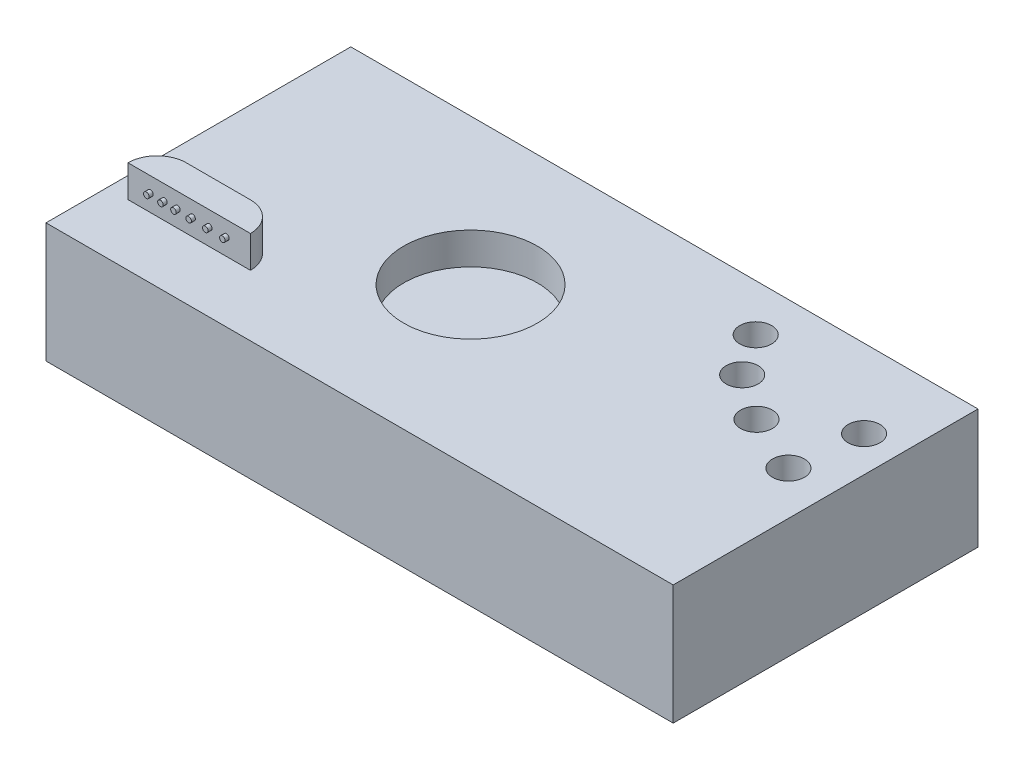
ISO-10303-21;
HEADER;
FILE_DESCRIPTION(('STEP AP214'),'2;1');
FILE_NAME('part.step','',(''),(''),'','','');
FILE_SCHEMA(('AUTOMOTIVE_DESIGN { 1 0 10303 214 1 1 1 1 }'));
ENDSEC;
DATA;
#1=APPLICATION_CONTEXT('core data for automotive mechanical design processes');
#2=APPLICATION_PROTOCOL_DEFINITION('international standard','automotive_design',2000,#1);
#3=PRODUCT_CONTEXT('',#1,'mechanical');
#4=PRODUCT('Part','Part','',(#3));
#5=PRODUCT_RELATED_PRODUCT_CATEGORY('part','',(#4));
#6=PRODUCT_DEFINITION_FORMATION('','',#4);
#7=PRODUCT_DEFINITION_CONTEXT('part definition',#1,'design');
#8=PRODUCT_DEFINITION('design','',#6,#7);
#9=PRODUCT_DEFINITION_SHAPE('','',#8);
#10=(LENGTH_UNIT() NAMED_UNIT(*) SI_UNIT(.MILLI.,.METRE.));
#11=(NAMED_UNIT(*) PLANE_ANGLE_UNIT() SI_UNIT($,.RADIAN.));
#12=(NAMED_UNIT(*) SI_UNIT($,.STERADIAN.) SOLID_ANGLE_UNIT());
#13=UNCERTAINTY_MEASURE_WITH_UNIT(LENGTH_MEASURE(1.E-05),#10,'distance_accuracy_value','');
#14=(GEOMETRIC_REPRESENTATION_CONTEXT(3) GLOBAL_UNCERTAINTY_ASSIGNED_CONTEXT((#13)) GLOBAL_UNIT_ASSIGNED_CONTEXT((#10,
#11,#12)) REPRESENTATION_CONTEXT('',''));
#15=CARTESIAN_POINT('',(0.,0.,0.));
#16=DIRECTION('',(0.,0.,1.));
#17=DIRECTION('',(1.,0.,0.));
#18=AXIS2_PLACEMENT_3D('',#15,#16,#17);
#19=CARTESIAN_POINT('',(0.,38.,0.));
#20=DIRECTION('',(0.,0.,-1.));
#21=DIRECTION('',(-1.,0.,0.));
#22=AXIS2_PLACEMENT_3D('',#19,#20,#21);
#23=PLANE('',#22);
#24=CARTESIAN_POINT('',(-118.643776601544,34.2556021608402,0.));
#25=DIRECTION('',(0.,0.,-1.));
#26=DIRECTION('',(-1.,0.,0.));
#27=AXIS2_PLACEMENT_3D('',#24,#25,#26);
#28=CIRCLE('',#27,0.700000000000014);
#29=CARTESIAN_POINT('',(-119.343776601544,34.2556021608402,0.));
#30=VERTEX_POINT('',#29);
#31=EDGE_CURVE('E41',#30,#30,#28,.F.);
#32=ORIENTED_EDGE('',*,*,#31,.F.);
#33=EDGE_LOOP('',(#32));
#34=FACE_BOUND('',#33,.T.);
#35=CARTESIAN_POINT('',(-126.62164694386,34.2556021608402,0.));
#36=DIRECTION('',(0.,0.,-1.));
#37=DIRECTION('',(-1.,0.,0.));
#38=AXIS2_PLACEMENT_3D('',#35,#36,#37);
#39=CIRCLE('',#38,0.700000000000014);
#40=CARTESIAN_POINT('',(-127.32164694386,34.2556021608402,0.));
#41=VERTEX_POINT('',#40);
#42=EDGE_CURVE('E204',#41,#41,#39,.F.);
#43=ORIENTED_EDGE('',*,*,#42,.F.);
#44=EDGE_LOOP('',(#43));
#45=FACE_BOUND('',#44,.T.);
#46=CARTESIAN_POINT('',(-133.407576230198,34.2556021608402,0.));
#47=DIRECTION('',(0.,0.,-1.));
#48=DIRECTION('',(-1.,0.,0.));
#49=AXIS2_PLACEMENT_3D('',#46,#47,#48);
#50=CIRCLE('',#49,0.700000000000014);
#51=CARTESIAN_POINT('',(-134.107576230198,34.2556021608402,0.));
#52=VERTEX_POINT('',#51);
#53=EDGE_CURVE('E198',#52,#52,#50,.F.);
#54=ORIENTED_EDGE('',*,*,#53,.F.);
#55=EDGE_LOOP('',(#54));
#56=FACE_BOUND('',#55,.T.);
#57=DIRECTION('',(1.,0.,0.));
#58=VECTOR('',#57,1.);
#59=CARTESIAN_POINT('',(0.,30.,0.));
#60=LINE('',#59,#58);
#61=CARTESIAN_POINT('',(-139.021341000415,30.,0.));
#62=VERTEX_POINT('',#61);
#63=CARTESIAN_POINT('',(-108.32637044787,30.,0.));
#64=VERTEX_POINT('',#63);
#65=EDGE_CURVE('E132',#62,#64,#60,.T.);
#66=ORIENTED_EDGE('',*,*,#65,.T.);
#67=DIRECTION('',(0.,-1.,0.));
#68=VECTOR('',#67,1.);
#69=CARTESIAN_POINT('',(-108.32637044787,38.,0.));
#70=LINE('',#69,#68);
#71=CARTESIAN_POINT('',(-108.32637044787,38.,0.));
#72=VERTEX_POINT('',#71);
#73=EDGE_CURVE('E112',#72,#64,#70,.T.);
#74=ORIENTED_EDGE('',*,*,#73,.F.);
#75=DIRECTION('',(1.,0.,0.));
#76=VECTOR('',#75,1.);
#77=CARTESIAN_POINT('',(0.,38.,0.));
#78=LINE('',#77,#76);
#79=CARTESIAN_POINT('',(-139.021341000415,38.,0.));
#80=VERTEX_POINT('',#79);
#81=EDGE_CURVE('E119',#80,#72,#78,.T.);
#82=ORIENTED_EDGE('',*,*,#81,.F.);
#83=DIRECTION('',(0.,-1.,0.));
#84=VECTOR('',#83,1.);
#85=CARTESIAN_POINT('',(-139.021341000415,38.,0.));
#86=LINE('',#85,#84);
#87=EDGE_CURVE('E341',#80,#62,#86,.T.);
#88=ORIENTED_EDGE('',*,*,#87,.T.);
#89=EDGE_LOOP('',(#66,#74,#82,#88));
#90=FACE_BOUND('',#89,.T.);
#91=CARTESIAN_POINT('',(-129.880481724484,34.2556021608402,0.));
#92=DIRECTION('',(0.,0.,-1.));
#93=DIRECTION('',(-1.,0.,0.));
#94=AXIS2_PLACEMENT_3D('',#91,#92,#93);
#95=CIRCLE('',#94,0.700000000000014);
#96=CARTESIAN_POINT('',(-130.580481724484,34.2556021608402,0.));
#97=VERTEX_POINT('',#96);
#98=EDGE_CURVE('E201',#97,#97,#95,.F.);
#99=ORIENTED_EDGE('',*,*,#98,.F.);
#100=EDGE_LOOP('',(#99));
#101=FACE_BOUND('',#100,.T.);
#102=CARTESIAN_POINT('',(-122.826292713043,34.2556021608402,0.));
#103=DIRECTION('',(0.,0.,-1.));
#104=DIRECTION('',(-1.,0.,0.));
#105=AXIS2_PLACEMENT_3D('',#102,#103,#104);
#106=CIRCLE('',#105,0.700000000000001);
#107=CARTESIAN_POINT('',(-123.526292713043,34.2556021608402,0.));
#108=VERTEX_POINT('',#107);
#109=EDGE_CURVE('E207',#108,#108,#106,.F.);
#110=ORIENTED_EDGE('',*,*,#109,.F.);
#111=EDGE_LOOP('',(#110));
#112=FACE_BOUND('',#111,.T.);
#113=CARTESIAN_POINT('',(-114.360631582784,34.2556021608402,0.));
#114=DIRECTION('',(0.,0.,-1.));
#115=DIRECTION('',(-1.,0.,0.));
#116=AXIS2_PLACEMENT_3D('',#113,#114,#115);
#117=CIRCLE('',#116,0.700000000000001);
#118=CARTESIAN_POINT('',(-115.060631582784,34.2556021608402,0.));
#119=VERTEX_POINT('',#118);
#120=EDGE_CURVE('E11',#119,#119,#117,.F.);
#121=ORIENTED_EDGE('',*,*,#120,.F.);
#122=EDGE_LOOP('',(#121));
#123=FACE_BOUND('',#122,.T.);
#124=ADVANCED_FACE('F33',(#34,#45,#56,#90,#101,#112,#123),#23,.F.);
#125=CARTESIAN_POINT('',(0.,30.,0.));
#126=DIRECTION('',(0.,1.,0.));
#127=DIRECTION('',(0.,0.,1.));
#128=AXIS2_PLACEMENT_3D('',#125,#126,#127);
#129=PLANE('',#128);
#130=DIRECTION('',(0.,0.,-1.));
#131=VECTOR('',#130,1.);
#132=CARTESIAN_POINT('',(12.9286709295116,30.,-61.0807962414128));
#133=LINE('',#132,#131);
#134=CARTESIAN_POINT('',(12.9286709295116,30.,15.3072915219354));
#135=VERTEX_POINT('',#134);
#136=CARTESIAN_POINT('',(12.9286709295116,30.,-61.0807962414128));
#137=VERTEX_POINT('',#136);
#138=EDGE_CURVE('E176',#135,#137,#133,.T.);
#139=ORIENTED_EDGE('',*,*,#138,.T.);
#140=DIRECTION('',(-1.,0.,0.));
#141=VECTOR('',#140,1.);
#142=CARTESIAN_POINT('',(-144.257219335657,30.,-61.0807962414128));
#143=LINE('',#142,#141);
#144=CARTESIAN_POINT('',(-144.257219335657,30.,-61.0807962414128));
#145=VERTEX_POINT('',#144);
#146=EDGE_CURVE('E86',#137,#145,#143,.T.);
#147=ORIENTED_EDGE('',*,*,#146,.T.);
#148=DIRECTION('',(0.,0.,1.));
#149=VECTOR('',#148,1.);
#150=CARTESIAN_POINT('',(-144.257219335657,30.,-61.0807962414128));
#151=LINE('',#150,#149);
#152=CARTESIAN_POINT('',(-144.257219335657,30.,15.3072915219354));
#153=VERTEX_POINT('',#152);
#154=EDGE_CURVE('E179',#145,#153,#151,.T.);
#155=ORIENTED_EDGE('',*,*,#154,.T.);
#156=DIRECTION('',(1.,0.,0.));
#157=VECTOR('',#156,1.);
#158=CARTESIAN_POINT('',(-144.257219335657,30.,15.3072915219354));
#159=LINE('',#158,#157);
#160=EDGE_CURVE('E57',#153,#135,#159,.T.);
#161=ORIENTED_EDGE('',*,*,#160,.T.);
#162=EDGE_LOOP('',(#139,#147,#155,#161));
#163=FACE_BOUND('',#162,.T.);
#164=CARTESIAN_POINT('',(2.02036490287583,30.,-24.4830234031497));
#165=DIRECTION('',(0.,1.,0.));
#166=DIRECTION('',(0.,0.,1.));
#167=AXIS2_PLACEMENT_3D('',#164,#165,#166);
#168=CIRCLE('',#167,4.);
#169=CARTESIAN_POINT('',(2.02036490287583,30.,-20.4830234031497));
#170=VERTEX_POINT('',#169);
#171=EDGE_CURVE('E167',#170,#170,#168,.T.);
#172=ORIENTED_EDGE('',*,*,#171,.F.);
#173=EDGE_LOOP('',(#172));
#174=FACE_BOUND('',#173,.T.);
#175=CARTESIAN_POINT('',(-12.5829509776736,30.,-31.0781758100234));
#176=DIRECTION('',(0.,1.,0.));
#177=DIRECTION('',(0.,0.,1.));
#178=AXIS2_PLACEMENT_3D('',#175,#176,#177);
#179=CIRCLE('',#178,4.);
#180=CARTESIAN_POINT('',(-12.5829509776736,30.,-27.0781758100234));
#181=VERTEX_POINT('',#180);
#182=EDGE_CURVE('E161',#181,#181,#179,.T.);
#183=ORIENTED_EDGE('',*,*,#182,.F.);
#184=EDGE_LOOP('',(#183));
#185=FACE_BOUND('',#184,.T.);
#186=CARTESIAN_POINT('',(-24.0347259278337,30.,-38.9392785824043));
#187=DIRECTION('',(0.,1.,0.));
#188=DIRECTION('',(0.,0.,1.));
#189=AXIS2_PLACEMENT_3D('',#186,#187,#188);
#190=CIRCLE('',#189,4.);
#191=CARTESIAN_POINT('',(-24.0347259278337,30.,-34.9392785824043));
#192=VERTEX_POINT('',#191);
#193=EDGE_CURVE('E155',#192,#192,#190,.T.);
#194=ORIENTED_EDGE('',*,*,#193,.F.);
#195=EDGE_LOOP('',(#194));
#196=FACE_BOUND('',#195,.T.);
#197=CARTESIAN_POINT('',(-31.0292800998013,30.,-49.3292547073736));
#198=DIRECTION('',(0.,1.,0.));
#199=DIRECTION('',(0.,0.,1.));
#200=AXIS2_PLACEMENT_3D('',#197,#198,#199);
#201=CIRCLE('',#200,4.);
#202=CARTESIAN_POINT('',(-31.0292800998013,30.,-45.3292547073736));
#203=VERTEX_POINT('',#202);
#204=EDGE_CURVE('E149',#203,#203,#201,.T.);
#205=ORIENTED_EDGE('',*,*,#204,.F.);
#206=EDGE_LOOP('',(#205));
#207=FACE_BOUND('',#206,.T.);
#208=CARTESIAN_POINT('',(4.00506731392625,30.,-41.4545287317196));
#209=DIRECTION('',(0.,1.,0.));
#210=DIRECTION('',(0.,0.,1.));
#211=AXIS2_PLACEMENT_3D('',#208,#209,#210);
#212=CIRCLE('',#211,4.);
#213=CARTESIAN_POINT('',(4.00506731392625,30.,-37.4545287317196));
#214=VERTEX_POINT('',#213);
#215=EDGE_CURVE('E144',#214,#214,#212,.T.);
#216=ORIENTED_EDGE('',*,*,#215,.F.);
#217=EDGE_LOOP('',(#216));
#218=FACE_BOUND('',#217,.T.);
#219=CARTESIAN_POINT('',(-77.6505829250027,30.,-24.4830234031497));
#220=DIRECTION('',(0.,1.,0.));
#221=DIRECTION('',(0.,0.,1.));
#222=AXIS2_PLACEMENT_3D('',#219,#220,#221);
#223=CIRCLE('',#222,16.7519195729512);
#224=CARTESIAN_POINT('',(-77.6505829250027,30.,-7.73110383019846));
#225=VERTEX_POINT('',#224);
#226=EDGE_CURVE('E134',#225,#225,#223,.T.);
#227=ORIENTED_EDGE('',*,*,#226,.F.);
#228=EDGE_LOOP('',(#227));
#229=FACE_BOUND('',#228,.T.);
#230=CARTESIAN_POINT('',(-115.629013378353,30.,0.));
#231=DIRECTION('',(0.,1.,0.));
#232=DIRECTION('',(0.,0.,1.));
#233=AXIS2_PLACEMENT_3D('',#230,#231,#232);
#234=CIRCLE('',#233,7.30264293048322);
#235=CARTESIAN_POINT('',(-115.629013378353,30.,-7.30264293048322));
#236=VERTEX_POINT('',#235);
#237=EDGE_CURVE('E332',#64,#236,#234,.T.);
#238=ORIENTED_EDGE('',*,*,#237,.F.);
#239=ORIENTED_EDGE('',*,*,#65,.F.);
#240=CARTESIAN_POINT('',(-131.718698069932,30.,0.));
#241=DIRECTION('',(0.,1.,0.));
#242=DIRECTION('',(0.,0.,1.));
#243=AXIS2_PLACEMENT_3D('',#240,#241,#242);
#244=CIRCLE('',#243,7.30264293048322);
#245=CARTESIAN_POINT('',(-131.718698069932,30.,-7.30264293048322));
#246=VERTEX_POINT('',#245);
#247=EDGE_CURVE('E128',#246,#62,#244,.T.);
#248=ORIENTED_EDGE('',*,*,#247,.F.);
#249=DIRECTION('',(1.,0.,0.));
#250=VECTOR('',#249,1.);
#251=CARTESIAN_POINT('',(0.,30.,-7.30264293048322));
#252=LINE('',#251,#250);
#253=EDGE_CURVE('E48',#246,#236,#252,.T.);
#254=ORIENTED_EDGE('',*,*,#253,.T.);
#255=EDGE_LOOP('',(#238,#239,#248,#254));
#256=FACE_BOUND('',#255,.T.);
#257=ADVANCED_FACE('F216',(#163,#174,#185,#196,#207,#218,#229,#256),#129,.T.);
#258=CARTESIAN_POINT('',(12.9286709295116,30.,-61.0807962414128));
#259=DIRECTION('',(-1.,0.,0.));
#260=DIRECTION('',(0.,0.,1.));
#261=AXIS2_PLACEMENT_3D('',#258,#259,#260);
#262=PLANE('',#261);
#263=DIRECTION('',(0.,0.,-1.));
#264=VECTOR('',#263,1.);
#265=CARTESIAN_POINT('',(12.9286709295116,0.,-61.0807962414128));
#266=LINE('',#265,#264);
#267=CARTESIAN_POINT('',(12.9286709295116,0.,15.3072915219354));
#268=VERTEX_POINT('',#267);
#269=CARTESIAN_POINT('',(12.9286709295116,0.,-61.0807962414128));
#270=VERTEX_POINT('',#269);
#271=EDGE_CURVE('E173',#268,#270,#266,.T.);
#272=ORIENTED_EDGE('',*,*,#271,.T.);
#273=DIRECTION('',(0.,-1.,0.));
#274=VECTOR('',#273,1.);
#275=CARTESIAN_POINT('',(12.9286709295116,30.,-61.0807962414128));
#276=LINE('',#275,#274);
#277=EDGE_CURVE('E196',#137,#270,#276,.T.);
#278=ORIENTED_EDGE('',*,*,#277,.F.);
#279=ORIENTED_EDGE('',*,*,#138,.F.);
#280=DIRECTION('',(0.,-1.,0.));
#281=VECTOR('',#280,1.);
#282=CARTESIAN_POINT('',(12.9286709295116,30.,15.3072915219354));
#283=LINE('',#282,#281);
#284=EDGE_CURVE('E182',#135,#268,#283,.T.);
#285=ORIENTED_EDGE('',*,*,#284,.T.);
#286=EDGE_LOOP('',(#272,#278,#279,#285));
#287=FACE_BOUND('',#286,.T.);
#288=ADVANCED_FACE('F35',(#287),#262,.F.);
#289=CARTESIAN_POINT('',(-144.257219335657,30.,-61.0807962414128));
#290=DIRECTION('',(0.,0.,1.));
#291=DIRECTION('',(1.,0.,0.));
#292=AXIS2_PLACEMENT_3D('',#289,#290,#291);
#293=PLANE('',#292);
#294=DIRECTION('',(-1.,0.,0.));
#295=VECTOR('',#294,1.);
#296=CARTESIAN_POINT('',(-144.257219335657,0.,-61.0807962414128));
#297=LINE('',#296,#295);
#298=CARTESIAN_POINT('',(-144.257219335657,0.,-61.0807962414128));
#299=VERTEX_POINT('',#298);
#300=EDGE_CURVE('E185',#270,#299,#297,.T.);
#301=ORIENTED_EDGE('',*,*,#300,.T.);
#302=DIRECTION('',(0.,-1.,0.));
#303=VECTOR('',#302,1.);
#304=CARTESIAN_POINT('',(-144.257219335657,30.,-61.0807962414128));
#305=LINE('',#304,#303);
#306=EDGE_CURVE('E193',#145,#299,#305,.T.);
#307=ORIENTED_EDGE('',*,*,#306,.F.);
#308=ORIENTED_EDGE('',*,*,#146,.F.);
#309=ORIENTED_EDGE('',*,*,#277,.T.);
#310=EDGE_LOOP('',(#301,#307,#308,#309));
#311=FACE_BOUND('',#310,.T.);
#312=ADVANCED_FACE('F306',(#311),#293,.F.);
#313=CARTESIAN_POINT('',(-144.257219335657,30.,-61.0807962414128));
#314=DIRECTION('',(1.,0.,0.));
#315=DIRECTION('',(0.,0.,-1.));
#316=AXIS2_PLACEMENT_3D('',#313,#314,#315);
#317=PLANE('',#316);
#318=DIRECTION('',(0.,0.,1.));
#319=VECTOR('',#318,1.);
#320=CARTESIAN_POINT('',(-144.257219335657,0.,-61.0807962414128));
#321=LINE('',#320,#319);
#322=CARTESIAN_POINT('',(-144.257219335657,0.,15.3072915219354));
#323=VERTEX_POINT('',#322);
#324=EDGE_CURVE('E187',#299,#323,#321,.T.);
#325=ORIENTED_EDGE('',*,*,#324,.T.);
#326=DIRECTION('',(0.,-1.,0.));
#327=VECTOR('',#326,1.);
#328=CARTESIAN_POINT('',(-144.257219335657,30.,15.3072915219354));
#329=LINE('',#328,#327);
#330=EDGE_CURVE('E191',#153,#323,#329,.T.);
#331=ORIENTED_EDGE('',*,*,#330,.F.);
#332=ORIENTED_EDGE('',*,*,#154,.F.);
#333=ORIENTED_EDGE('',*,*,#306,.T.);
#334=EDGE_LOOP('',(#325,#331,#332,#333));
#335=FACE_BOUND('',#334,.T.);
#336=ADVANCED_FACE('F304',(#335),#317,.F.);
#337=CARTESIAN_POINT('',(-144.257219335657,30.,15.3072915219354));
#338=DIRECTION('',(0.,0.,-1.));
#339=DIRECTION('',(-1.,0.,0.));
#340=AXIS2_PLACEMENT_3D('',#337,#338,#339);
#341=PLANE('',#340);
#342=DIRECTION('',(1.,0.,0.));
#343=VECTOR('',#342,1.);
#344=CARTESIAN_POINT('',(-144.257219335657,0.,15.3072915219354));
#345=LINE('',#344,#343);
#346=EDGE_CURVE('E78',#323,#268,#345,.T.);
#347=ORIENTED_EDGE('',*,*,#346,.T.);
#348=ORIENTED_EDGE('',*,*,#284,.F.);
#349=ORIENTED_EDGE('',*,*,#160,.F.);
#350=ORIENTED_EDGE('',*,*,#330,.T.);
#351=EDGE_LOOP('',(#347,#348,#349,#350));
#352=FACE_BOUND('',#351,.T.);
#353=ADVANCED_FACE('F300',(#352),#341,.F.);
#354=CARTESIAN_POINT('',(0.,0.,0.));
#355=DIRECTION('',(0.,1.,0.));
#356=DIRECTION('',(0.,0.,1.));
#357=AXIS2_PLACEMENT_3D('',#354,#355,#356);
#358=PLANE('',#357);
#359=ORIENTED_EDGE('',*,*,#271,.F.);
#360=ORIENTED_EDGE('',*,*,#346,.F.);
#361=ORIENTED_EDGE('',*,*,#324,.F.);
#362=ORIENTED_EDGE('',*,*,#300,.F.);
#363=EDGE_LOOP('',(#359,#360,#361,#362));
#364=FACE_BOUND('',#363,.T.);
#365=ADVANCED_FACE('F294',(#364),#358,.F.);
#366=CARTESIAN_POINT('',(2.02036490287583,22.,-24.4830234031497));
#367=DIRECTION('',(0.,1.,0.));
#368=DIRECTION('',(0.,0.,1.));
#369=AXIS2_PLACEMENT_3D('',#366,#367,#368);
#370=CYLINDRICAL_SURFACE('',#369,4.);
#371=CARTESIAN_POINT('',(2.02036490287583,22.,-24.4830234031497));
#372=DIRECTION('',(0.,1.,0.));
#373=DIRECTION('',(0.,0.,1.));
#374=AXIS2_PLACEMENT_3D('',#371,#372,#373);
#375=CIRCLE('',#374,4.);
#376=CARTESIAN_POINT('',(2.02036490287583,22.,-20.4830234031497));
#377=VERTEX_POINT('',#376);
#378=EDGE_CURVE('E170',#377,#377,#375,.T.);
#379=ORIENTED_EDGE('',*,*,#378,.F.);
#380=EDGE_LOOP('',(#379));
#381=FACE_BOUND('',#380,.T.);
#382=ORIENTED_EDGE('',*,*,#171,.T.);
#383=EDGE_LOOP('',(#382));
#384=FACE_BOUND('',#383,.T.);
#385=ADVANCED_FACE('F290',(#381,#384),#370,.F.);
#386=CARTESIAN_POINT('',(2.02036490287583,22.,-24.4830234031497));
#387=DIRECTION('',(0.,1.,0.));
#388=DIRECTION('',(0.,0.,1.));
#389=AXIS2_PLACEMENT_3D('',#386,#387,#388);
#390=PLANE('',#389);
#391=ORIENTED_EDGE('',*,*,#378,.T.);
#392=EDGE_LOOP('',(#391));
#393=FACE_BOUND('',#392,.T.);
#394=ADVANCED_FACE('F286',(#393),#390,.T.);
#395=CARTESIAN_POINT('',(-12.5829509776736,22.,-31.0781758100234));
#396=DIRECTION('',(0.,1.,0.));
#397=DIRECTION('',(0.,0.,1.));
#398=AXIS2_PLACEMENT_3D('',#395,#396,#397);
#399=CYLINDRICAL_SURFACE('',#398,4.);
#400=CARTESIAN_POINT('',(-12.5829509776736,22.,-31.0781758100234));
#401=DIRECTION('',(0.,1.,0.));
#402=DIRECTION('',(0.,0.,1.));
#403=AXIS2_PLACEMENT_3D('',#400,#401,#402);
#404=CIRCLE('',#403,4.);
#405=CARTESIAN_POINT('',(-12.5829509776736,22.,-27.0781758100234));
#406=VERTEX_POINT('',#405);
#407=EDGE_CURVE('E164',#406,#406,#404,.T.);
#408=ORIENTED_EDGE('',*,*,#407,.F.);
#409=EDGE_LOOP('',(#408));
#410=FACE_BOUND('',#409,.T.);
#411=ORIENTED_EDGE('',*,*,#182,.T.);
#412=EDGE_LOOP('',(#411));
#413=FACE_BOUND('',#412,.T.);
#414=ADVANCED_FACE('F282',(#410,#413),#399,.F.);
#415=CARTESIAN_POINT('',(-12.5829509776736,22.,-31.0781758100234));
#416=DIRECTION('',(0.,1.,0.));
#417=DIRECTION('',(0.,0.,1.));
#418=AXIS2_PLACEMENT_3D('',#415,#416,#417);
#419=PLANE('',#418);
#420=ORIENTED_EDGE('',*,*,#407,.T.);
#421=EDGE_LOOP('',(#420));
#422=FACE_BOUND('',#421,.T.);
#423=ADVANCED_FACE('F278',(#422),#419,.T.);
#424=CARTESIAN_POINT('',(-24.0347259278337,22.,-38.9392785824043));
#425=DIRECTION('',(0.,1.,0.));
#426=DIRECTION('',(0.,0.,1.));
#427=AXIS2_PLACEMENT_3D('',#424,#425,#426);
#428=CYLINDRICAL_SURFACE('',#427,4.);
#429=CARTESIAN_POINT('',(-24.0347259278337,22.,-38.9392785824043));
#430=DIRECTION('',(0.,1.,0.));
#431=DIRECTION('',(0.,0.,1.));
#432=AXIS2_PLACEMENT_3D('',#429,#430,#431);
#433=CIRCLE('',#432,4.);
#434=CARTESIAN_POINT('',(-24.0347259278337,22.,-34.9392785824043));
#435=VERTEX_POINT('',#434);
#436=EDGE_CURVE('E158',#435,#435,#433,.T.);
#437=ORIENTED_EDGE('',*,*,#436,.F.);
#438=EDGE_LOOP('',(#437));
#439=FACE_BOUND('',#438,.T.);
#440=ORIENTED_EDGE('',*,*,#193,.T.);
#441=EDGE_LOOP('',(#440));
#442=FACE_BOUND('',#441,.T.);
#443=ADVANCED_FACE('F274',(#439,#442),#428,.F.);
#444=CARTESIAN_POINT('',(-24.0347259278337,22.,-38.9392785824043));
#445=DIRECTION('',(0.,1.,0.));
#446=DIRECTION('',(0.,0.,1.));
#447=AXIS2_PLACEMENT_3D('',#444,#445,#446);
#448=PLANE('',#447);
#449=ORIENTED_EDGE('',*,*,#436,.T.);
#450=EDGE_LOOP('',(#449));
#451=FACE_BOUND('',#450,.T.);
#452=ADVANCED_FACE('F270',(#451),#448,.T.);
#453=CARTESIAN_POINT('',(-31.0292800998013,22.,-49.3292547073736));
#454=DIRECTION('',(0.,1.,0.));
#455=DIRECTION('',(0.,0.,1.));
#456=AXIS2_PLACEMENT_3D('',#453,#454,#455);
#457=CYLINDRICAL_SURFACE('',#456,4.);
#458=CARTESIAN_POINT('',(-31.0292800998013,22.,-49.3292547073736));
#459=DIRECTION('',(0.,1.,0.));
#460=DIRECTION('',(0.,0.,1.));
#461=AXIS2_PLACEMENT_3D('',#458,#459,#460);
#462=CIRCLE('',#461,4.);
#463=CARTESIAN_POINT('',(-31.0292800998013,22.,-45.3292547073736));
#464=VERTEX_POINT('',#463);
#465=EDGE_CURVE('E152',#464,#464,#462,.T.);
#466=ORIENTED_EDGE('',*,*,#465,.F.);
#467=EDGE_LOOP('',(#466));
#468=FACE_BOUND('',#467,.T.);
#469=ORIENTED_EDGE('',*,*,#204,.T.);
#470=EDGE_LOOP('',(#469));
#471=FACE_BOUND('',#470,.T.);
#472=ADVANCED_FACE('F266',(#468,#471),#457,.F.);
#473=CARTESIAN_POINT('',(-31.0292800998013,22.,-49.3292547073736));
#474=DIRECTION('',(0.,1.,0.));
#475=DIRECTION('',(0.,0.,1.));
#476=AXIS2_PLACEMENT_3D('',#473,#474,#475);
#477=PLANE('',#476);
#478=ORIENTED_EDGE('',*,*,#465,.T.);
#479=EDGE_LOOP('',(#478));
#480=FACE_BOUND('',#479,.T.);
#481=ADVANCED_FACE('F262',(#480),#477,.T.);
#482=CARTESIAN_POINT('',(4.00506731392625,22.,-41.4545287317196));
#483=DIRECTION('',(0.,1.,0.));
#484=DIRECTION('',(0.,0.,1.));
#485=AXIS2_PLACEMENT_3D('',#482,#483,#484);
#486=CYLINDRICAL_SURFACE('',#485,4.);
#487=CARTESIAN_POINT('',(4.00506731392625,22.,-41.4545287317196));
#488=DIRECTION('',(0.,1.,0.));
#489=DIRECTION('',(0.,0.,1.));
#490=AXIS2_PLACEMENT_3D('',#487,#488,#489);
#491=CIRCLE('',#490,4.);
#492=CARTESIAN_POINT('',(4.00506731392625,22.,-37.4545287317196));
#493=VERTEX_POINT('',#492);
#494=EDGE_CURVE('E146',#493,#493,#491,.T.);
#495=ORIENTED_EDGE('',*,*,#494,.F.);
#496=EDGE_LOOP('',(#495));
#497=FACE_BOUND('',#496,.T.);
#498=ORIENTED_EDGE('',*,*,#215,.T.);
#499=EDGE_LOOP('',(#498));
#500=FACE_BOUND('',#499,.T.);
#501=ADVANCED_FACE('F258',(#497,#500),#486,.F.);
#502=CARTESIAN_POINT('',(4.00506731392625,22.,-41.4545287317196));
#503=DIRECTION('',(0.,1.,0.));
#504=DIRECTION('',(0.,0.,1.));
#505=AXIS2_PLACEMENT_3D('',#502,#503,#504);
#506=PLANE('',#505);
#507=ORIENTED_EDGE('',*,*,#494,.T.);
#508=EDGE_LOOP('',(#507));
#509=FACE_BOUND('',#508,.T.);
#510=ADVANCED_FACE('F254',(#509),#506,.T.);
#511=CARTESIAN_POINT('',(-77.6505829250027,22.,-24.4830234031497));
#512=DIRECTION('',(0.,1.,0.));
#513=DIRECTION('',(0.,0.,1.));
#514=AXIS2_PLACEMENT_3D('',#511,#512,#513);
#515=CYLINDRICAL_SURFACE('',#514,16.7519195729512);
#516=CARTESIAN_POINT('',(-77.6505829250027,22.,-24.4830234031497));
#517=DIRECTION('',(0.,1.,0.));
#518=DIRECTION('',(0.,0.,1.));
#519=AXIS2_PLACEMENT_3D('',#516,#517,#518);
#520=CIRCLE('',#519,16.7519195729512);
#521=CARTESIAN_POINT('',(-77.6505829250027,22.,-7.73110383019846));
#522=VERTEX_POINT('',#521);
#523=EDGE_CURVE('E137',#522,#522,#520,.T.);
#524=ORIENTED_EDGE('',*,*,#523,.F.);
#525=EDGE_LOOP('',(#524));
#526=FACE_BOUND('',#525,.T.);
#527=ORIENTED_EDGE('',*,*,#226,.T.);
#528=EDGE_LOOP('',(#527));
#529=FACE_BOUND('',#528,.T.);
#530=ADVANCED_FACE('F250',(#526,#529),#515,.F.);
#531=CARTESIAN_POINT('',(-77.6505829250027,22.,-24.4830234031497));
#532=DIRECTION('',(0.,1.,0.));
#533=DIRECTION('',(0.,0.,1.));
#534=AXIS2_PLACEMENT_3D('',#531,#532,#533);
#535=PLANE('',#534);
#536=ORIENTED_EDGE('',*,*,#523,.T.);
#537=EDGE_LOOP('',(#536));
#538=FACE_BOUND('',#537,.T.);
#539=ADVANCED_FACE('F246',(#538),#535,.T.);
#540=CARTESIAN_POINT('',(-115.629013378353,38.,0.));
#541=DIRECTION('',(0.,-1.,0.));
#542=DIRECTION('',(0.,0.,-1.));
#543=AXIS2_PLACEMENT_3D('',#540,#541,#542);
#544=CYLINDRICAL_SURFACE('',#543,7.30264293048322);
#545=ORIENTED_EDGE('',*,*,#237,.T.);
#546=DIRECTION('',(0.,-1.,0.));
#547=VECTOR('',#546,1.);
#548=CARTESIAN_POINT('',(-115.629013378353,38.,-7.30264293048322));
#549=LINE('',#548,#547);
#550=CARTESIAN_POINT('',(-115.629013378353,38.,-7.30264293048322));
#551=VERTEX_POINT('',#550);
#552=EDGE_CURVE('E114',#551,#236,#549,.T.);
#553=ORIENTED_EDGE('',*,*,#552,.F.);
#554=CARTESIAN_POINT('',(-115.629013378353,38.,0.));
#555=DIRECTION('',(0.,1.,0.));
#556=DIRECTION('',(0.,0.,1.));
#557=AXIS2_PLACEMENT_3D('',#554,#555,#556);
#558=CIRCLE('',#557,7.30264293048322);
#559=EDGE_CURVE('E107',#72,#551,#558,.T.);
#560=ORIENTED_EDGE('',*,*,#559,.F.);
#561=ORIENTED_EDGE('',*,*,#73,.T.);
#562=EDGE_LOOP('',(#545,#553,#560,#561));
#563=FACE_BOUND('',#562,.T.);
#564=ADVANCED_FACE('F110',(#563),#544,.T.);
#565=CARTESIAN_POINT('',(0.,38.,-7.30264293048322));
#566=DIRECTION('',(0.,0.,-1.));
#567=DIRECTION('',(-1.,0.,0.));
#568=AXIS2_PLACEMENT_3D('',#565,#566,#567);
#569=PLANE('',#568);
#570=ORIENTED_EDGE('',*,*,#253,.F.);
#571=DIRECTION('',(0.,-1.,0.));
#572=VECTOR('',#571,1.);
#573=CARTESIAN_POINT('',(-131.718698069932,38.,-7.30264293048322));
#574=LINE('',#573,#572);
#575=CARTESIAN_POINT('',(-131.718698069932,38.,-7.30264293048322));
#576=VERTEX_POINT('',#575);
#577=EDGE_CURVE('E139',#576,#246,#574,.T.);
#578=ORIENTED_EDGE('',*,*,#577,.F.);
#579=DIRECTION('',(1.,0.,0.));
#580=VECTOR('',#579,1.);
#581=CARTESIAN_POINT('',(0.,38.,-7.30264293048322));
#582=LINE('',#581,#580);
#583=EDGE_CURVE('E118',#576,#551,#582,.T.);
#584=ORIENTED_EDGE('',*,*,#583,.T.);
#585=ORIENTED_EDGE('',*,*,#552,.T.);
#586=EDGE_LOOP('',(#570,#578,#584,#585));
#587=FACE_BOUND('',#586,.T.);
#588=ADVANCED_FACE('F241',(#587),#569,.T.);
#589=CARTESIAN_POINT('',(-131.718698069932,38.,0.));
#590=DIRECTION('',(0.,-1.,0.));
#591=DIRECTION('',(0.,0.,-1.));
#592=AXIS2_PLACEMENT_3D('',#589,#590,#591);
#593=CYLINDRICAL_SURFACE('',#592,7.30264293048322);
#594=ORIENTED_EDGE('',*,*,#247,.T.);
#595=ORIENTED_EDGE('',*,*,#87,.F.);
#596=CARTESIAN_POINT('',(-131.718698069932,38.,0.));
#597=DIRECTION('',(0.,1.,0.));
#598=DIRECTION('',(0.,0.,1.));
#599=AXIS2_PLACEMENT_3D('',#596,#597,#598);
#600=CIRCLE('',#599,7.30264293048322);
#601=EDGE_CURVE('E124',#576,#80,#600,.T.);
#602=ORIENTED_EDGE('',*,*,#601,.F.);
#603=ORIENTED_EDGE('',*,*,#577,.T.);
#604=EDGE_LOOP('',(#594,#595,#602,#603));
#605=FACE_BOUND('',#604,.T.);
#606=ADVANCED_FACE('F234',(#605),#593,.T.);
#607=CARTESIAN_POINT('',(0.,38.,0.));
#608=DIRECTION('',(0.,1.,0.));
#609=DIRECTION('',(0.,0.,1.));
#610=AXIS2_PLACEMENT_3D('',#607,#608,#609);
#611=PLANE('',#610);
#612=ORIENTED_EDGE('',*,*,#81,.T.);
#613=ORIENTED_EDGE('',*,*,#559,.T.);
#614=ORIENTED_EDGE('',*,*,#583,.F.);
#615=ORIENTED_EDGE('',*,*,#601,.T.);
#616=EDGE_LOOP('',(#612,#613,#614,#615));
#617=FACE_BOUND('',#616,.T.);
#618=ADVANCED_FACE('F122',(#617),#611,.T.);
#619=CARTESIAN_POINT('',(-133.407576230198,34.2556021608402,1.));
#620=DIRECTION('',(0.,0.,-1.));
#621=DIRECTION('',(-1.,0.,0.));
#622=AXIS2_PLACEMENT_3D('',#619,#620,#621);
#623=CYLINDRICAL_SURFACE('',#622,0.700000000000014);
#624=CARTESIAN_POINT('',(-133.407576230198,34.2556021608402,1.));
#625=DIRECTION('',(0.,0.,1.));
#626=DIRECTION('',(1.,0.,0.));
#627=AXIS2_PLACEMENT_3D('',#624,#625,#626);
#628=CIRCLE('',#627,0.700000000000014);
#629=CARTESIAN_POINT('',(-132.707576230198,34.2556021608402,1.));
#630=VERTEX_POINT('',#629);
#631=EDGE_CURVE('E336',#630,#630,#628,.T.);
#632=ORIENTED_EDGE('',*,*,#631,.F.);
#633=EDGE_LOOP('',(#632));
#634=FACE_BOUND('',#633,.T.);
#635=ORIENTED_EDGE('',*,*,#53,.T.);
#636=EDGE_LOOP('',(#635));
#637=FACE_BOUND('',#636,.T.);
#638=ADVANCED_FACE('F222',(#634,#637),#623,.T.);
#639=CARTESIAN_POINT('',(-133.407576230198,34.2556021608402,1.));
#640=DIRECTION('',(0.,0.,1.));
#641=DIRECTION('',(1.,0.,0.));
#642=AXIS2_PLACEMENT_3D('',#639,#640,#641);
#643=PLANE('',#642);
#644=ORIENTED_EDGE('',*,*,#631,.T.);
#645=EDGE_LOOP('',(#644));
#646=FACE_BOUND('',#645,.T.);
#647=ADVANCED_FACE('F224',(#646),#643,.T.);
#648=CARTESIAN_POINT('',(-129.880481724484,34.2556021608402,1.));
#649=DIRECTION('',(0.,0.,-1.));
#650=DIRECTION('',(-1.,0.,0.));
#651=AXIS2_PLACEMENT_3D('',#648,#649,#650);
#652=CYLINDRICAL_SURFACE('',#651,0.700000000000014);
#653=CARTESIAN_POINT('',(-129.880481724484,34.2556021608402,1.));
#654=DIRECTION('',(0.,0.,1.));
#655=DIRECTION('',(1.,0.,0.));
#656=AXIS2_PLACEMENT_3D('',#653,#654,#655);
#657=CIRCLE('',#656,0.700000000000014);
#658=CARTESIAN_POINT('',(-129.180481724484,34.2556021608402,1.));
#659=VERTEX_POINT('',#658);
#660=EDGE_CURVE('E346',#659,#659,#657,.T.);
#661=ORIENTED_EDGE('',*,*,#660,.F.);
#662=EDGE_LOOP('',(#661));
#663=FACE_BOUND('',#662,.T.);
#664=ORIENTED_EDGE('',*,*,#98,.T.);
#665=EDGE_LOOP('',(#664));
#666=FACE_BOUND('',#665,.T.);
#667=ADVANCED_FACE('F231',(#663,#666),#652,.T.);
#668=CARTESIAN_POINT('',(-129.880481724484,34.2556021608402,1.));
#669=DIRECTION('',(0.,0.,1.));
#670=DIRECTION('',(1.,0.,0.));
#671=AXIS2_PLACEMENT_3D('',#668,#669,#670);
#672=PLANE('',#671);
#673=ORIENTED_EDGE('',*,*,#660,.T.);
#674=EDGE_LOOP('',(#673));
#675=FACE_BOUND('',#674,.T.);
#676=ADVANCED_FACE('F397',(#675),#672,.T.);
#677=CARTESIAN_POINT('',(-126.62164694386,34.2556021608402,1.));
#678=DIRECTION('',(0.,0.,-1.));
#679=DIRECTION('',(-1.,0.,0.));
#680=AXIS2_PLACEMENT_3D('',#677,#678,#679);
#681=CYLINDRICAL_SURFACE('',#680,0.700000000000014);
#682=CARTESIAN_POINT('',(-126.62164694386,34.2556021608402,1.));
#683=DIRECTION('',(0.,0.,1.));
#684=DIRECTION('',(1.,0.,0.));
#685=AXIS2_PLACEMENT_3D('',#682,#683,#684);
#686=CIRCLE('',#685,0.700000000000014);
#687=CARTESIAN_POINT('',(-125.92164694386,34.2556021608402,1.));
#688=VERTEX_POINT('',#687);
#689=EDGE_CURVE('E349',#688,#688,#686,.T.);
#690=ORIENTED_EDGE('',*,*,#689,.F.);
#691=EDGE_LOOP('',(#690));
#692=FACE_BOUND('',#691,.T.);
#693=ORIENTED_EDGE('',*,*,#42,.T.);
#694=EDGE_LOOP('',(#693));
#695=FACE_BOUND('',#694,.T.);
#696=ADVANCED_FACE('F393',(#692,#695),#681,.T.);
#697=CARTESIAN_POINT('',(-126.62164694386,34.2556021608402,1.));
#698=DIRECTION('',(0.,0.,1.));
#699=DIRECTION('',(1.,0.,0.));
#700=AXIS2_PLACEMENT_3D('',#697,#698,#699);
#701=PLANE('',#700);
#702=ORIENTED_EDGE('',*,*,#689,.T.);
#703=EDGE_LOOP('',(#702));
#704=FACE_BOUND('',#703,.T.);
#705=ADVANCED_FACE('F389',(#704),#701,.T.);
#706=CARTESIAN_POINT('',(-122.826292713043,34.2556021608402,1.));
#707=DIRECTION('',(0.,0.,-1.));
#708=DIRECTION('',(-1.,0.,0.));
#709=AXIS2_PLACEMENT_3D('',#706,#707,#708);
#710=CYLINDRICAL_SURFACE('',#709,0.700000000000001);
#711=CARTESIAN_POINT('',(-122.826292713043,34.2556021608402,1.));
#712=DIRECTION('',(0.,0.,1.));
#713=DIRECTION('',(1.,0.,0.));
#714=AXIS2_PLACEMENT_3D('',#711,#712,#713);
#715=CIRCLE('',#714,0.700000000000001);
#716=CARTESIAN_POINT('',(-122.126292713043,34.2556021608402,1.));
#717=VERTEX_POINT('',#716);
#718=EDGE_CURVE('E352',#717,#717,#715,.T.);
#719=ORIENTED_EDGE('',*,*,#718,.F.);
#720=EDGE_LOOP('',(#719));
#721=FACE_BOUND('',#720,.T.);
#722=ORIENTED_EDGE('',*,*,#109,.T.);
#723=EDGE_LOOP('',(#722));
#724=FACE_BOUND('',#723,.T.);
#725=ADVANCED_FACE('F385',(#721,#724),#710,.T.);
#726=CARTESIAN_POINT('',(-122.826292713043,34.2556021608402,1.));
#727=DIRECTION('',(0.,0.,1.));
#728=DIRECTION('',(1.,0.,0.));
#729=AXIS2_PLACEMENT_3D('',#726,#727,#728);
#730=PLANE('',#729);
#731=ORIENTED_EDGE('',*,*,#718,.T.);
#732=EDGE_LOOP('',(#731));
#733=FACE_BOUND('',#732,.T.);
#734=ADVANCED_FACE('F381',(#733),#730,.T.);
#735=CARTESIAN_POINT('',(-118.643776601544,34.2556021608402,1.));
#736=DIRECTION('',(0.,0.,-1.));
#737=DIRECTION('',(-1.,0.,0.));
#738=AXIS2_PLACEMENT_3D('',#735,#736,#737);
#739=CYLINDRICAL_SURFACE('',#738,0.700000000000014);
#740=CARTESIAN_POINT('',(-118.643776601544,34.2556021608402,1.));
#741=DIRECTION('',(0.,0.,1.));
#742=DIRECTION('',(1.,0.,0.));
#743=AXIS2_PLACEMENT_3D('',#740,#741,#742);
#744=CIRCLE('',#743,0.700000000000014);
#745=CARTESIAN_POINT('',(-117.943776601544,34.2556021608402,1.));
#746=VERTEX_POINT('',#745);
#747=EDGE_CURVE('E355',#746,#746,#744,.T.);
#748=ORIENTED_EDGE('',*,*,#747,.F.);
#749=EDGE_LOOP('',(#748));
#750=FACE_BOUND('',#749,.T.);
#751=ORIENTED_EDGE('',*,*,#31,.T.);
#752=EDGE_LOOP('',(#751));
#753=FACE_BOUND('',#752,.T.);
#754=ADVANCED_FACE('F212',(#750,#753),#739,.T.);
#755=CARTESIAN_POINT('',(-118.643776601544,34.2556021608402,1.));
#756=DIRECTION('',(0.,0.,1.));
#757=DIRECTION('',(1.,0.,0.));
#758=AXIS2_PLACEMENT_3D('',#755,#756,#757);
#759=PLANE('',#758);
#760=ORIENTED_EDGE('',*,*,#747,.T.);
#761=EDGE_LOOP('',(#760));
#762=FACE_BOUND('',#761,.T.);
#763=ADVANCED_FACE('F367',(#762),#759,.T.);
#764=CARTESIAN_POINT('',(-114.360631582784,34.2556021608402,1.));
#765=DIRECTION('',(0.,0.,-1.));
#766=DIRECTION('',(-1.,0.,0.));
#767=AXIS2_PLACEMENT_3D('',#764,#765,#766);
#768=CYLINDRICAL_SURFACE('',#767,0.700000000000001);
#769=CARTESIAN_POINT('',(-114.360631582784,34.2556021608402,1.));
#770=DIRECTION('',(0.,0.,1.));
#771=DIRECTION('',(1.,0.,0.));
#772=AXIS2_PLACEMENT_3D('',#769,#770,#771);
#773=CIRCLE('',#772,0.700000000000001);
#774=CARTESIAN_POINT('',(-113.660631582784,34.2556021608402,1.));
#775=VERTEX_POINT('',#774);
#776=EDGE_CURVE('E358',#775,#775,#773,.T.);
#777=ORIENTED_EDGE('',*,*,#776,.F.);
#778=EDGE_LOOP('',(#777));
#779=FACE_BOUND('',#778,.T.);
#780=ORIENTED_EDGE('',*,*,#120,.T.);
#781=EDGE_LOOP('',(#780));
#782=FACE_BOUND('',#781,.T.);
#783=ADVANCED_FACE('F364',(#779,#782),#768,.T.);
#784=CARTESIAN_POINT('',(-114.360631582784,34.2556021608402,1.));
#785=DIRECTION('',(0.,0.,1.));
#786=DIRECTION('',(1.,0.,0.));
#787=AXIS2_PLACEMENT_3D('',#784,#785,#786);
#788=PLANE('',#787);
#789=ORIENTED_EDGE('',*,*,#776,.T.);
#790=EDGE_LOOP('',(#789));
#791=FACE_BOUND('',#790,.T.);
#792=ADVANCED_FACE('F362',(#791),#788,.T.);
#793=CLOSED_SHELL('',(#124,#257,#288,#312,#336,#353,#365,#385,#394,#414,#423,#443,#452,#472,
#481,#501,#510,#530,#539,#564,#588,#606,#618,#638,#647,#667,#676,#696,#705,#725,#734,#754,#763,
#783,#792));
#794=MANIFOLD_SOLID_BREP('B2',#793);
#795=ADVANCED_BREP_SHAPE_REPRESENTATION('',(#18,#794),#14);
#796=SHAPE_DEFINITION_REPRESENTATION(#9,#795);
ENDSEC;
END-ISO-10303-21;
